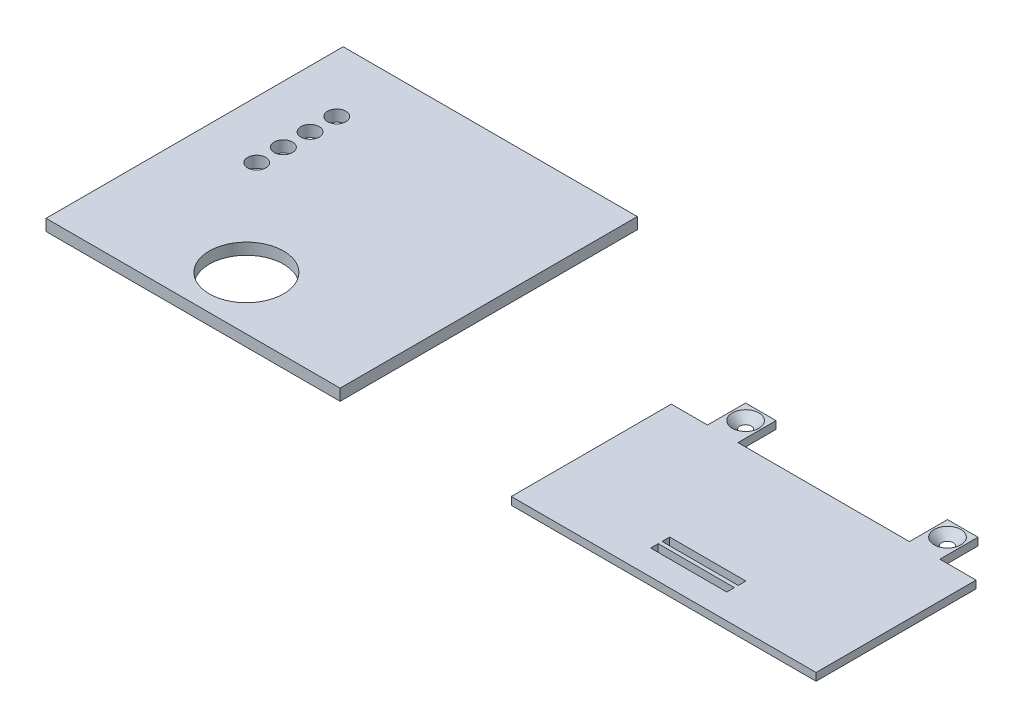
ISO-10303-21;
HEADER;
FILE_DESCRIPTION(('STEP AP214'),'2;1');
FILE_NAME('part.step','',(''),(''),'','','');
FILE_SCHEMA(('AUTOMOTIVE_DESIGN { 1 0 10303 214 1 1 1 1 }'));
ENDSEC;
DATA;
#1=APPLICATION_CONTEXT('core data for automotive mechanical design processes');
#2=APPLICATION_PROTOCOL_DEFINITION('international standard','automotive_design',2000,#1);
#3=PRODUCT_CONTEXT('',#1,'mechanical');
#4=PRODUCT('Part','Part','',(#3));
#5=PRODUCT_RELATED_PRODUCT_CATEGORY('part','',(#4));
#6=PRODUCT_DEFINITION_FORMATION('','',#4);
#7=PRODUCT_DEFINITION_CONTEXT('part definition',#1,'design');
#8=PRODUCT_DEFINITION('design','',#6,#7);
#9=PRODUCT_DEFINITION_SHAPE('','',#8);
#10=(LENGTH_UNIT() NAMED_UNIT(*) SI_UNIT(.MILLI.,.METRE.));
#11=(NAMED_UNIT(*) PLANE_ANGLE_UNIT() SI_UNIT($,.RADIAN.));
#12=(NAMED_UNIT(*) SI_UNIT($,.STERADIAN.) SOLID_ANGLE_UNIT());
#13=UNCERTAINTY_MEASURE_WITH_UNIT(LENGTH_MEASURE(1.E-05),#10,'distance_accuracy_value','');
#14=(GEOMETRIC_REPRESENTATION_CONTEXT(3) GLOBAL_UNCERTAINTY_ASSIGNED_CONTEXT((#13)) GLOBAL_UNIT_ASSIGNED_CONTEXT((#10,
#11,#12)) REPRESENTATION_CONTEXT('',''));
#15=CARTESIAN_POINT('',(0.,0.,0.));
#16=DIRECTION('',(0.,0.,1.));
#17=DIRECTION('',(1.,0.,0.));
#18=AXIS2_PLACEMENT_3D('',#15,#16,#17);
#19=CARTESIAN_POINT('',(-36.8821964652426,-2.,-61.3775431410421));
#20=DIRECTION('',(0.,0.,-1.));
#21=DIRECTION('',(-1.,0.,0.));
#22=AXIS2_PLACEMENT_3D('',#19,#20,#21);
#23=PLANE('',#22);
#24=DIRECTION('',(-1.,0.,0.));
#25=VECTOR('',#24,1.);
#26=CARTESIAN_POINT('',(-36.8821964652426,0.,-61.3775431410421));
#27=LINE('',#26,#25);
#28=CARTESIAN_POINT('',(33.6178035347574,0.,-61.3775431410421));
#29=VERTEX_POINT('',#28);
#30=CARTESIAN_POINT('',(25.6178035347574,0.,-61.3775431410421));
#31=VERTEX_POINT('',#30);
#32=EDGE_CURVE('E309',#29,#31,#27,.T.);
#33=ORIENTED_EDGE('',*,*,#32,.F.);
#34=DIRECTION('',(0.,-1.,0.));
#35=VECTOR('',#34,1.);
#36=CARTESIAN_POINT('',(33.6178035347574,64.,-61.3775431410421));
#37=LINE('',#36,#35);
#38=CARTESIAN_POINT('',(33.6178035347574,-2.,-61.3775431410421));
#39=VERTEX_POINT('',#38);
#40=EDGE_CURVE('E263',#29,#39,#37,.T.);
#41=ORIENTED_EDGE('',*,*,#40,.T.);
#42=DIRECTION('',(-1.,0.,0.));
#43=VECTOR('',#42,1.);
#44=CARTESIAN_POINT('',(-36.8821964652426,-2.,-61.3775431410421));
#45=LINE('',#44,#43);
#46=CARTESIAN_POINT('',(25.6178035347574,-2.,-61.3775431410421));
#47=VERTEX_POINT('',#46);
#48=EDGE_CURVE('E316',#39,#47,#45,.T.);
#49=ORIENTED_EDGE('',*,*,#48,.T.);
#50=DIRECTION('',(0.,-1.,0.));
#51=VECTOR('',#50,1.);
#52=CARTESIAN_POINT('',(25.6178035347574,54.,-61.3775431410421));
#53=LINE('',#52,#51);
#54=EDGE_CURVE('E276',#31,#47,#53,.T.);
#55=ORIENTED_EDGE('',*,*,#54,.F.);
#56=EDGE_LOOP('',(#33,#41,#49,#55));
#57=FACE_BOUND('',#56,.T.);
#58=ADVANCED_FACE('F46',(#57),#23,.T.);
#59=CARTESIAN_POINT('',(0.,-2.,0.));
#60=DIRECTION('',(0.,1.,0.));
#61=DIRECTION('',(0.,0.,1.));
#62=AXIS2_PLACEMENT_3D('',#59,#60,#61);
#63=PLANE('',#62);
#64=DIRECTION('',(-1.,0.,0.));
#65=VECTOR('',#64,1.);
#66=CARTESIAN_POINT('',(-6.88219646524261,-1.99999999999995,-17.9462363350968));
#67=LINE('',#66,#65);
#68=CARTESIAN_POINT('',(13.1178035347574,-1.99999999999995,-17.9462363350969));
#69=VERTEX_POINT('',#68);
#70=CARTESIAN_POINT('',(-6.88219646524261,-1.99999999999995,-17.9462363350968));
#71=VERTEX_POINT('',#70);
#72=EDGE_CURVE('E196',#69,#71,#67,.T.);
#73=ORIENTED_EDGE('',*,*,#72,.T.);
#74=DIRECTION('',(0.,0.,1.));
#75=VECTOR('',#74,1.);
#76=CARTESIAN_POINT('',(-6.88219646524261,-1.99999999999995,-17.9462363350968));
#77=LINE('',#76,#75);
#78=CARTESIAN_POINT('',(-6.88219646524261,-1.99999999999995,-15.9462363350968));
#79=VERTEX_POINT('',#78);
#80=EDGE_CURVE('E188',#71,#79,#77,.T.);
#81=ORIENTED_EDGE('',*,*,#80,.T.);
#82=DIRECTION('',(1.,0.,0.));
#83=VECTOR('',#82,1.);
#84=CARTESIAN_POINT('',(-6.88219646524261,-1.99999999999995,-15.9462363350968));
#85=LINE('',#84,#83);
#86=CARTESIAN_POINT('',(13.1178035347574,-2.,-15.9462363350968));
#87=VERTEX_POINT('',#86);
#88=EDGE_CURVE('E199',#79,#87,#85,.T.);
#89=ORIENTED_EDGE('',*,*,#88,.T.);
#90=DIRECTION('',(0.,0.,-1.));
#91=VECTOR('',#90,1.);
#92=CARTESIAN_POINT('',(13.1178035347574,-1.99999999999995,-17.9462363350969));
#93=LINE('',#92,#91);
#94=EDGE_CURVE('E62',#87,#69,#93,.T.);
#95=ORIENTED_EDGE('',*,*,#94,.T.);
#96=EDGE_LOOP('',(#73,#81,#89,#95));
#97=FACE_BOUND('',#96,.T.);
#98=DIRECTION('',(-1.,0.,0.));
#99=VECTOR('',#98,1.);
#100=CARTESIAN_POINT('',(-6.88219646524261,-1.99999999999995,-20.9462363350968));
#101=LINE('',#100,#99);
#102=CARTESIAN_POINT('',(13.1178035347574,-1.99999999999995,-20.9462363350968));
#103=VERTEX_POINT('',#102);
#104=CARTESIAN_POINT('',(-6.88219646524261,-1.99999999999995,-20.9462363350968));
#105=VERTEX_POINT('',#104);
#106=EDGE_CURVE('E234',#103,#105,#101,.T.);
#107=ORIENTED_EDGE('',*,*,#106,.T.);
#108=DIRECTION('',(0.,0.,1.));
#109=VECTOR('',#108,1.);
#110=CARTESIAN_POINT('',(-6.88219646524261,-1.99999999999995,-20.9462363350968));
#111=LINE('',#110,#109);
#112=CARTESIAN_POINT('',(-6.88219646524261,-1.99999999999995,-18.9462363350968));
#113=VERTEX_POINT('',#112);
#114=EDGE_CURVE('E226',#105,#113,#111,.T.);
#115=ORIENTED_EDGE('',*,*,#114,.T.);
#116=DIRECTION('',(1.,0.,0.));
#117=VECTOR('',#116,1.);
#118=CARTESIAN_POINT('',(-6.88219646524261,-1.99999999999995,-18.9462363350968));
#119=LINE('',#118,#117);
#120=CARTESIAN_POINT('',(13.1178035347574,-2.,-18.9462363350968));
#121=VERTEX_POINT('',#120);
#122=EDGE_CURVE('E229',#113,#121,#119,.T.);
#123=ORIENTED_EDGE('',*,*,#122,.T.);
#124=DIRECTION('',(0.,0.,-1.));
#125=VECTOR('',#124,1.);
#126=CARTESIAN_POINT('',(13.1178035347574,-1.99999999999995,-20.9462363350968));
#127=LINE('',#126,#125);
#128=EDGE_CURVE('E70',#121,#103,#127,.T.);
#129=ORIENTED_EDGE('',*,*,#128,.T.);
#130=EDGE_LOOP('',(#107,#115,#123,#129));
#131=FACE_BOUND('',#130,.T.);
#132=CARTESIAN_POINT('',(29.6178035347574,-2.,-57.3775431410421));
#133=DIRECTION('',(0.,1.,0.));
#134=DIRECTION('',(0.,0.,1.));
#135=AXIS2_PLACEMENT_3D('',#132,#133,#134);
#136=CIRCLE('',#135,1.5);
#137=CARTESIAN_POINT('',(29.6178035347574,-2.,-55.8775431410421));
#138=VERTEX_POINT('',#137);
#139=EDGE_CURVE('E222',#138,#138,#136,.F.);
#140=ORIENTED_EDGE('',*,*,#139,.F.);
#141=EDGE_LOOP('',(#140));
#142=FACE_BOUND('',#141,.T.);
#143=CARTESIAN_POINT('',(-23.3821964652426,-2.,-57.3775431410421));
#144=DIRECTION('',(0.,1.,0.));
#145=DIRECTION('',(0.,0.,1.));
#146=AXIS2_PLACEMENT_3D('',#143,#144,#145);
#147=CIRCLE('',#146,1.5);
#148=CARTESIAN_POINT('',(-23.3821964652426,-2.,-55.8775431410421));
#149=VERTEX_POINT('',#148);
#150=EDGE_CURVE('E257',#149,#149,#147,.F.);
#151=ORIENTED_EDGE('',*,*,#150,.F.);
#152=EDGE_LOOP('',(#151));
#153=FACE_BOUND('',#152,.T.);
#154=DIRECTION('',(0.,0.,-1.));
#155=VECTOR('',#154,1.);
#156=CARTESIAN_POINT('',(33.6178035347574,-2.,0.));
#157=LINE('',#156,#155);
#158=CARTESIAN_POINT('',(33.6178035347574,-2.,-51.3775431410421));
#159=VERTEX_POINT('',#158);
#160=EDGE_CURVE('E271',#159,#39,#157,.T.);
#161=ORIENTED_EDGE('',*,*,#160,.F.);
#162=DIRECTION('',(-1.,0.,0.));
#163=VECTOR('',#162,1.);
#164=CARTESIAN_POINT('',(0.,-2.,-51.3775431410421));
#165=LINE('',#164,#163);
#166=CARTESIAN_POINT('',(43.1178035347574,-2.,-51.3775431410421));
#167=VERTEX_POINT('',#166);
#168=EDGE_CURVE('E269',#167,#159,#165,.T.);
#169=ORIENTED_EDGE('',*,*,#168,.F.);
#170=DIRECTION('',(0.,0.,-1.));
#171=VECTOR('',#170,1.);
#172=CARTESIAN_POINT('',(43.1178035347574,-2.,-61.3775431410421));
#173=LINE('',#172,#171);
#174=CARTESIAN_POINT('',(43.1178035347574,-2.,-9.37754314104211));
#175=VERTEX_POINT('',#174);
#176=EDGE_CURVE('E312',#175,#167,#173,.T.);
#177=ORIENTED_EDGE('',*,*,#176,.F.);
#178=DIRECTION('',(1.,0.,0.));
#179=VECTOR('',#178,1.);
#180=CARTESIAN_POINT('',(-36.8821964652426,-2.,-9.37754314104211));
#181=LINE('',#180,#179);
#182=CARTESIAN_POINT('',(-36.8821964652426,-2.,-9.37754314104211));
#183=VERTEX_POINT('',#182);
#184=EDGE_CURVE('E308',#183,#175,#181,.T.);
#185=ORIENTED_EDGE('',*,*,#184,.F.);
#186=DIRECTION('',(0.,0.,1.));
#187=VECTOR('',#186,1.);
#188=CARTESIAN_POINT('',(-36.8821964652426,-2.,-61.3775431410421));
#189=LINE('',#188,#187);
#190=CARTESIAN_POINT('',(-36.8821964652426,-2.,-51.3775431410421));
#191=VERTEX_POINT('',#190);
#192=EDGE_CURVE('E306',#191,#183,#189,.T.);
#193=ORIENTED_EDGE('',*,*,#192,.F.);
#194=DIRECTION('',(1.,0.,0.));
#195=VECTOR('',#194,1.);
#196=CARTESIAN_POINT('',(0.,-2.,-51.3775431410421));
#197=LINE('',#196,#195);
#198=CARTESIAN_POINT('',(-27.3821964652426,-2.,-51.3775431410421));
#199=VERTEX_POINT('',#198);
#200=EDGE_CURVE('E295',#191,#199,#197,.T.);
#201=ORIENTED_EDGE('',*,*,#200,.T.);
#202=DIRECTION('',(0.,0.,-1.));
#203=VECTOR('',#202,1.);
#204=CARTESIAN_POINT('',(-27.3821964652426,-2.,0.));
#205=LINE('',#204,#203);
#206=CARTESIAN_POINT('',(-27.3821964652426,-2.,-61.3775431410421));
#207=VERTEX_POINT('',#206);
#208=EDGE_CURVE('E302',#199,#207,#205,.T.);
#209=ORIENTED_EDGE('',*,*,#208,.T.);
#210=CARTESIAN_POINT('',(-19.3821964652426,-2.,-61.3775431410421));
#211=VERTEX_POINT('',#210);
#212=EDGE_CURVE('E315',#211,#207,#45,.T.);
#213=ORIENTED_EDGE('',*,*,#212,.F.);
#214=DIRECTION('',(0.,0.,-1.));
#215=VECTOR('',#214,1.);
#216=CARTESIAN_POINT('',(-19.3821964652426,-2.,0.));
#217=LINE('',#216,#215);
#218=CARTESIAN_POINT('',(-19.3821964652426,-2.,-51.3775431410421));
#219=VERTEX_POINT('',#218);
#220=EDGE_CURVE('E289',#219,#211,#217,.T.);
#221=ORIENTED_EDGE('',*,*,#220,.F.);
#222=DIRECTION('',(-1.,0.,0.));
#223=VECTOR('',#222,1.);
#224=CARTESIAN_POINT('',(0.,-2.,-51.3775431410421));
#225=LINE('',#224,#223);
#226=CARTESIAN_POINT('',(25.6178035347574,-2.,-51.3775431410421));
#227=VERTEX_POINT('',#226);
#228=EDGE_CURVE('E287',#227,#219,#225,.T.);
#229=ORIENTED_EDGE('',*,*,#228,.F.);
#230=DIRECTION('',(0.,0.,1.));
#231=VECTOR('',#230,1.);
#232=CARTESIAN_POINT('',(25.6178035347574,-2.,0.));
#233=LINE('',#232,#231);
#234=EDGE_CURVE('E285',#47,#227,#233,.T.);
#235=ORIENTED_EDGE('',*,*,#234,.F.);
#236=ORIENTED_EDGE('',*,*,#48,.F.);
#237=EDGE_LOOP('',(#161,#169,#177,#185,#193,#201,#209,#213,#221,#229,#235,#236));
#238=FACE_BOUND('',#237,.T.);
#239=ADVANCED_FACE('F203',(#97,#131,#142,#153,#238),#63,.F.);
#240=CARTESIAN_POINT('',(0.,0.,0.));
#241=DIRECTION('',(0.,1.,0.));
#242=DIRECTION('',(0.,0.,1.));
#243=AXIS2_PLACEMENT_3D('',#240,#241,#242);
#244=PLANE('',#243);
#245=DIRECTION('',(0.,0.,1.));
#246=VECTOR('',#245,1.);
#247=CARTESIAN_POINT('',(-6.88219646524261,0.,-17.9462363350968));
#248=LINE('',#247,#246);
#249=CARTESIAN_POINT('',(-6.88219646524261,0.,-17.9462363350968));
#250=VERTEX_POINT('',#249);
#251=CARTESIAN_POINT('',(-6.88219646524261,0.,-15.9462363350968));
#252=VERTEX_POINT('',#251);
#253=EDGE_CURVE('E191',#250,#252,#248,.T.);
#254=ORIENTED_EDGE('',*,*,#253,.F.);
#255=DIRECTION('',(-1.,0.,0.));
#256=VECTOR('',#255,1.);
#257=CARTESIAN_POINT('',(-6.88219646524261,0.,-17.9462363350968));
#258=LINE('',#257,#256);
#259=CARTESIAN_POINT('',(13.1178035347574,0.,-17.9462363350969));
#260=VERTEX_POINT('',#259);
#261=EDGE_CURVE('E206',#260,#250,#258,.T.);
#262=ORIENTED_EDGE('',*,*,#261,.F.);
#263=DIRECTION('',(0.,0.,-1.));
#264=VECTOR('',#263,1.);
#265=CARTESIAN_POINT('',(13.1178035347574,0.,-17.9462363350969));
#266=LINE('',#265,#264);
#267=CARTESIAN_POINT('',(13.1178035347574,0.,-15.9462363350968));
#268=VERTEX_POINT('',#267);
#269=EDGE_CURVE('E209',#268,#260,#266,.T.);
#270=ORIENTED_EDGE('',*,*,#269,.F.);
#271=DIRECTION('',(1.,0.,0.));
#272=VECTOR('',#271,1.);
#273=CARTESIAN_POINT('',(-6.88219646524261,0.,-15.9462363350968));
#274=LINE('',#273,#272);
#275=EDGE_CURVE('E215',#252,#268,#274,.T.);
#276=ORIENTED_EDGE('',*,*,#275,.F.);
#277=EDGE_LOOP('',(#254,#262,#270,#276));
#278=FACE_BOUND('',#277,.T.);
#279=DIRECTION('',(0.,0.,1.));
#280=VECTOR('',#279,1.);
#281=CARTESIAN_POINT('',(-6.88219646524261,0.,-20.9462363350968));
#282=LINE('',#281,#280);
#283=CARTESIAN_POINT('',(-6.88219646524261,0.,-20.9462363350968));
#284=VERTEX_POINT('',#283);
#285=CARTESIAN_POINT('',(-6.88219646524261,0.,-18.9462363350968));
#286=VERTEX_POINT('',#285);
#287=EDGE_CURVE('E238',#284,#286,#282,.T.);
#288=ORIENTED_EDGE('',*,*,#287,.F.);
#289=DIRECTION('',(-1.,0.,0.));
#290=VECTOR('',#289,1.);
#291=CARTESIAN_POINT('',(-6.88219646524261,0.,-20.9462363350968));
#292=LINE('',#291,#290);
#293=CARTESIAN_POINT('',(13.1178035347574,0.,-20.9462363350968));
#294=VERTEX_POINT('',#293);
#295=EDGE_CURVE('E230',#294,#284,#292,.T.);
#296=ORIENTED_EDGE('',*,*,#295,.F.);
#297=DIRECTION('',(0.,0.,-1.));
#298=VECTOR('',#297,1.);
#299=CARTESIAN_POINT('',(13.1178035347574,0.,-20.9462363350968));
#300=LINE('',#299,#298);
#301=CARTESIAN_POINT('',(13.1178035347574,0.,-18.9462363350968));
#302=VERTEX_POINT('',#301);
#303=EDGE_CURVE('E243',#302,#294,#300,.T.);
#304=ORIENTED_EDGE('',*,*,#303,.F.);
#305=DIRECTION('',(1.,0.,0.));
#306=VECTOR('',#305,1.);
#307=CARTESIAN_POINT('',(-6.88219646524261,0.,-18.9462363350968));
#308=LINE('',#307,#306);
#309=EDGE_CURVE('E240',#286,#302,#308,.T.);
#310=ORIENTED_EDGE('',*,*,#309,.F.);
#311=EDGE_LOOP('',(#288,#296,#304,#310));
#312=FACE_BOUND('',#311,.T.);
#313=CARTESIAN_POINT('',(29.6178035347574,0.,-57.3775431410421));
#314=DIRECTION('',(0.,1.,0.));
#315=DIRECTION('',(0.,0.,1.));
#316=AXIS2_PLACEMENT_3D('',#313,#314,#315);
#317=CIRCLE('',#316,3.49999999999999);
#318=CARTESIAN_POINT('',(29.6178035347574,0.,-53.8775431410421));
#319=VERTEX_POINT('',#318);
#320=EDGE_CURVE('E12',#319,#319,#317,.F.);
#321=ORIENTED_EDGE('',*,*,#320,.T.);
#322=EDGE_LOOP('',(#321));
#323=FACE_BOUND('',#322,.T.);
#324=CARTESIAN_POINT('',(-23.3821964652426,0.,-57.3775431410421));
#325=DIRECTION('',(0.,1.,0.));
#326=DIRECTION('',(0.,0.,1.));
#327=AXIS2_PLACEMENT_3D('',#324,#325,#326);
#328=CIRCLE('',#327,3.49999999999999);
#329=CARTESIAN_POINT('',(-23.3821964652426,0.,-53.8775431410421));
#330=VERTEX_POINT('',#329);
#331=EDGE_CURVE('E55',#330,#330,#328,.F.);
#332=ORIENTED_EDGE('',*,*,#331,.T.);
#333=EDGE_LOOP('',(#332));
#334=FACE_BOUND('',#333,.T.);
#335=DIRECTION('',(-1.,0.,0.));
#336=VECTOR('',#335,1.);
#337=CARTESIAN_POINT('',(0.,0.,-51.3775431410421));
#338=LINE('',#337,#336);
#339=CARTESIAN_POINT('',(43.1178035347574,0.,-51.3775431410421));
#340=VERTEX_POINT('',#339);
#341=CARTESIAN_POINT('',(33.6178035347574,0.,-51.3775431410421));
#342=VERTEX_POINT('',#341);
#343=EDGE_CURVE('E266',#340,#342,#338,.T.);
#344=ORIENTED_EDGE('',*,*,#343,.T.);
#345=DIRECTION('',(0.,0.,-1.));
#346=VECTOR('',#345,1.);
#347=CARTESIAN_POINT('',(33.6178035347574,0.,0.));
#348=LINE('',#347,#346);
#349=EDGE_CURVE('E349',#342,#29,#348,.T.);
#350=ORIENTED_EDGE('',*,*,#349,.T.);
#351=ORIENTED_EDGE('',*,*,#32,.T.);
#352=DIRECTION('',(0.,0.,1.));
#353=VECTOR('',#352,1.);
#354=CARTESIAN_POINT('',(25.6178035347574,0.,0.));
#355=LINE('',#354,#353);
#356=CARTESIAN_POINT('',(25.6178035347574,0.,-51.3775431410421));
#357=VERTEX_POINT('',#356);
#358=EDGE_CURVE('E337',#31,#357,#355,.T.);
#359=ORIENTED_EDGE('',*,*,#358,.T.);
#360=DIRECTION('',(-1.,0.,0.));
#361=VECTOR('',#360,1.);
#362=CARTESIAN_POINT('',(0.,0.,-51.3775431410421));
#363=LINE('',#362,#361);
#364=CARTESIAN_POINT('',(-19.3821964652426,0.,-51.3775431410421));
#365=VERTEX_POINT('',#364);
#366=EDGE_CURVE('E340',#357,#365,#363,.T.);
#367=ORIENTED_EDGE('',*,*,#366,.T.);
#368=DIRECTION('',(0.,0.,-1.));
#369=VECTOR('',#368,1.);
#370=CARTESIAN_POINT('',(-19.3821964652426,0.,0.));
#371=LINE('',#370,#369);
#372=CARTESIAN_POINT('',(-19.3821964652426,0.,-61.3775431410421));
#373=VERTEX_POINT('',#372);
#374=EDGE_CURVE('E343',#365,#373,#371,.T.);
#375=ORIENTED_EDGE('',*,*,#374,.T.);
#376=CARTESIAN_POINT('',(-27.3821964652426,0.,-61.3775431410421));
#377=VERTEX_POINT('',#376);
#378=EDGE_CURVE('E326',#373,#377,#27,.T.);
#379=ORIENTED_EDGE('',*,*,#378,.T.);
#380=DIRECTION('',(0.,0.,-1.));
#381=VECTOR('',#380,1.);
#382=CARTESIAN_POINT('',(-27.3821964652426,0.,0.));
#383=LINE('',#382,#381);
#384=CARTESIAN_POINT('',(-27.3821964652426,0.,-51.3775431410421));
#385=VERTEX_POINT('',#384);
#386=EDGE_CURVE('E334',#385,#377,#383,.T.);
#387=ORIENTED_EDGE('',*,*,#386,.F.);
#388=DIRECTION('',(1.,0.,0.));
#389=VECTOR('',#388,1.);
#390=CARTESIAN_POINT('',(0.,0.,-51.3775431410421));
#391=LINE('',#390,#389);
#392=CARTESIAN_POINT('',(-36.8821964652426,0.,-51.3775431410421));
#393=VERTEX_POINT('',#392);
#394=EDGE_CURVE('E330',#393,#385,#391,.T.);
#395=ORIENTED_EDGE('',*,*,#394,.F.);
#396=DIRECTION('',(0.,0.,1.));
#397=VECTOR('',#396,1.);
#398=CARTESIAN_POINT('',(-36.8821964652426,0.,-61.3775431410421));
#399=LINE('',#398,#397);
#400=CARTESIAN_POINT('',(-36.8821964652426,0.,-9.37754314104211));
#401=VERTEX_POINT('',#400);
#402=EDGE_CURVE('E305',#393,#401,#399,.T.);
#403=ORIENTED_EDGE('',*,*,#402,.T.);
#404=DIRECTION('',(1.,0.,0.));
#405=VECTOR('',#404,1.);
#406=CARTESIAN_POINT('',(-36.8821964652426,0.,-9.37754314104211));
#407=LINE('',#406,#405);
#408=CARTESIAN_POINT('',(43.1178035347574,0.,-9.37754314104211));
#409=VERTEX_POINT('',#408);
#410=EDGE_CURVE('E320',#401,#409,#407,.T.);
#411=ORIENTED_EDGE('',*,*,#410,.T.);
#412=DIRECTION('',(0.,0.,-1.));
#413=VECTOR('',#412,1.);
#414=CARTESIAN_POINT('',(43.1178035347574,0.,-61.3775431410421));
#415=LINE('',#414,#413);
#416=EDGE_CURVE('E323',#409,#340,#415,.T.);
#417=ORIENTED_EDGE('',*,*,#416,.T.);
#418=EDGE_LOOP('',(#344,#350,#351,#359,#367,#375,#379,#387,#395,#403,#411,#417));
#419=FACE_BOUND('',#418,.T.);
#420=ADVANCED_FACE('F354',(#278,#312,#323,#334,#419),#244,.T.);
#421=CARTESIAN_POINT('',(43.1178035347574,-2.,-61.3775431410421));
#422=DIRECTION('',(1.,0.,0.));
#423=DIRECTION('',(0.,0.,-1.));
#424=AXIS2_PLACEMENT_3D('',#421,#422,#423);
#425=PLANE('',#424);
#426=ORIENTED_EDGE('',*,*,#176,.T.);
#427=DIRECTION('',(0.,1.,0.));
#428=VECTOR('',#427,1.);
#429=CARTESIAN_POINT('',(43.1178035347574,-2.,-51.3775431410421));
#430=LINE('',#429,#428);
#431=EDGE_CURVE('E346',#167,#340,#430,.T.);
#432=ORIENTED_EDGE('',*,*,#431,.T.);
#433=ORIENTED_EDGE('',*,*,#416,.F.);
#434=DIRECTION('',(0.,1.,0.));
#435=VECTOR('',#434,1.);
#436=CARTESIAN_POINT('',(43.1178035347574,-2.,-9.37754314104211));
#437=LINE('',#436,#435);
#438=EDGE_CURVE('E328',#175,#409,#437,.T.);
#439=ORIENTED_EDGE('',*,*,#438,.F.);
#440=EDGE_LOOP('',(#426,#432,#433,#439));
#441=FACE_BOUND('',#440,.T.);
#442=ADVANCED_FACE('F385',(#441),#425,.T.);
#443=ORIENTED_EDGE('',*,*,#378,.F.);
#444=DIRECTION('',(0.,-1.,0.));
#445=VECTOR('',#444,1.);
#446=CARTESIAN_POINT('',(-19.3821964652426,54.,-61.3775431410421));
#447=LINE('',#446,#445);
#448=EDGE_CURVE('E273',#373,#211,#447,.T.);
#449=ORIENTED_EDGE('',*,*,#448,.T.);
#450=ORIENTED_EDGE('',*,*,#212,.T.);
#451=DIRECTION('',(0.,1.,0.));
#452=VECTOR('',#451,1.);
#453=CARTESIAN_POINT('',(-27.3821964652426,-32.,-61.3775431410421));
#454=LINE('',#453,#452);
#455=EDGE_CURVE('E292',#207,#377,#454,.T.);
#456=ORIENTED_EDGE('',*,*,#455,.T.);
#457=EDGE_LOOP('',(#443,#449,#450,#456));
#458=FACE_BOUND('',#457,.T.);
#459=ADVANCED_FACE('F375',(#458),#23,.T.);
#460=CARTESIAN_POINT('',(-36.8821964652426,-2.,-61.3775431410421));
#461=DIRECTION('',(-1.,0.,0.));
#462=DIRECTION('',(0.,0.,1.));
#463=AXIS2_PLACEMENT_3D('',#460,#461,#462);
#464=PLANE('',#463);
#465=DIRECTION('',(0.,1.,0.));
#466=VECTOR('',#465,1.);
#467=CARTESIAN_POINT('',(-36.8821964652426,-32.,-51.3775431410421));
#468=LINE('',#467,#466);
#469=EDGE_CURVE('E291',#191,#393,#468,.T.);
#470=ORIENTED_EDGE('',*,*,#469,.F.);
#471=ORIENTED_EDGE('',*,*,#192,.T.);
#472=DIRECTION('',(0.,1.,0.));
#473=VECTOR('',#472,1.);
#474=CARTESIAN_POINT('',(-36.8821964652426,-2.,-9.37754314104211));
#475=LINE('',#474,#473);
#476=EDGE_CURVE('E318',#183,#401,#475,.T.);
#477=ORIENTED_EDGE('',*,*,#476,.T.);
#478=ORIENTED_EDGE('',*,*,#402,.F.);
#479=EDGE_LOOP('',(#470,#471,#477,#478));
#480=FACE_BOUND('',#479,.T.);
#481=ADVANCED_FACE('F384',(#480),#464,.T.);
#482=CARTESIAN_POINT('',(-36.8821964652426,-2.,-9.37754314104211));
#483=DIRECTION('',(0.,0.,1.));
#484=DIRECTION('',(1.,0.,0.));
#485=AXIS2_PLACEMENT_3D('',#482,#483,#484);
#486=PLANE('',#485);
#487=ORIENTED_EDGE('',*,*,#410,.F.);
#488=ORIENTED_EDGE('',*,*,#476,.F.);
#489=ORIENTED_EDGE('',*,*,#184,.T.);
#490=ORIENTED_EDGE('',*,*,#438,.T.);
#491=EDGE_LOOP('',(#487,#488,#489,#490));
#492=FACE_BOUND('',#491,.T.);
#493=ADVANCED_FACE('F391',(#492),#486,.T.);
#494=CARTESIAN_POINT('',(-27.3821964652426,-32.,-61.3775431410421));
#495=DIRECTION('',(1.,0.,0.));
#496=DIRECTION('',(0.,0.,-1.));
#497=AXIS2_PLACEMENT_3D('',#494,#495,#496);
#498=PLANE('',#497);
#499=DIRECTION('',(0.,1.,0.));
#500=VECTOR('',#499,1.);
#501=CARTESIAN_POINT('',(-27.3821964652426,-32.,-51.3775431410421));
#502=LINE('',#501,#500);
#503=EDGE_CURVE('E296',#199,#385,#502,.T.);
#504=ORIENTED_EDGE('',*,*,#503,.T.);
#505=ORIENTED_EDGE('',*,*,#386,.T.);
#506=ORIENTED_EDGE('',*,*,#455,.F.);
#507=ORIENTED_EDGE('',*,*,#208,.F.);
#508=EDGE_LOOP('',(#504,#505,#506,#507));
#509=FACE_BOUND('',#508,.T.);
#510=ADVANCED_FACE('F400',(#509),#498,.F.);
#511=CARTESIAN_POINT('',(-36.8821964652426,-32.,-51.3775431410421));
#512=DIRECTION('',(0.,0.,1.));
#513=DIRECTION('',(1.,0.,0.));
#514=AXIS2_PLACEMENT_3D('',#511,#512,#513);
#515=PLANE('',#514);
#516=ORIENTED_EDGE('',*,*,#469,.T.);
#517=ORIENTED_EDGE('',*,*,#394,.T.);
#518=ORIENTED_EDGE('',*,*,#503,.F.);
#519=ORIENTED_EDGE('',*,*,#200,.F.);
#520=EDGE_LOOP('',(#516,#517,#518,#519));
#521=FACE_BOUND('',#520,.T.);
#522=ADVANCED_FACE('F403',(#521),#515,.F.);
#523=CARTESIAN_POINT('',(-19.3821964652426,54.,-61.3775431410421));
#524=DIRECTION('',(1.,0.,0.));
#525=DIRECTION('',(0.,0.,-1.));
#526=AXIS2_PLACEMENT_3D('',#523,#524,#525);
#527=PLANE('',#526);
#528=ORIENTED_EDGE('',*,*,#220,.T.);
#529=ORIENTED_EDGE('',*,*,#448,.F.);
#530=ORIENTED_EDGE('',*,*,#374,.F.);
#531=DIRECTION('',(0.,-1.,0.));
#532=VECTOR('',#531,1.);
#533=CARTESIAN_POINT('',(-19.3821964652426,54.,-51.3775431410421));
#534=LINE('',#533,#532);
#535=EDGE_CURVE('E282',#365,#219,#534,.T.);
#536=ORIENTED_EDGE('',*,*,#535,.T.);
#537=EDGE_LOOP('',(#528,#529,#530,#536));
#538=FACE_BOUND('',#537,.T.);
#539=ADVANCED_FACE('F431',(#538),#527,.T.);
#540=CARTESIAN_POINT('',(-19.3821964652426,54.,-51.3775431410421));
#541=DIRECTION('',(0.,0.,-1.));
#542=DIRECTION('',(-1.,0.,0.));
#543=AXIS2_PLACEMENT_3D('',#540,#541,#542);
#544=PLANE('',#543);
#545=ORIENTED_EDGE('',*,*,#228,.T.);
#546=ORIENTED_EDGE('',*,*,#535,.F.);
#547=ORIENTED_EDGE('',*,*,#366,.F.);
#548=DIRECTION('',(0.,-1.,0.));
#549=VECTOR('',#548,1.);
#550=CARTESIAN_POINT('',(25.6178035347574,54.,-51.3775431410421));
#551=LINE('',#550,#549);
#552=EDGE_CURVE('E279',#357,#227,#551,.T.);
#553=ORIENTED_EDGE('',*,*,#552,.T.);
#554=EDGE_LOOP('',(#545,#546,#547,#553));
#555=FACE_BOUND('',#554,.T.);
#556=ADVANCED_FACE('F428',(#555),#544,.T.);
#557=CARTESIAN_POINT('',(25.6178035347574,54.,-61.3775431410421));
#558=DIRECTION('',(-1.,0.,0.));
#559=DIRECTION('',(0.,0.,1.));
#560=AXIS2_PLACEMENT_3D('',#557,#558,#559);
#561=PLANE('',#560);
#562=ORIENTED_EDGE('',*,*,#234,.T.);
#563=ORIENTED_EDGE('',*,*,#552,.F.);
#564=ORIENTED_EDGE('',*,*,#358,.F.);
#565=ORIENTED_EDGE('',*,*,#54,.T.);
#566=EDGE_LOOP('',(#562,#563,#564,#565));
#567=FACE_BOUND('',#566,.T.);
#568=ADVANCED_FACE('F423',(#567),#561,.T.);
#569=CARTESIAN_POINT('',(33.6178035347574,64.,-61.3775431410421));
#570=DIRECTION('',(1.,0.,0.));
#571=DIRECTION('',(0.,0.,-1.));
#572=AXIS2_PLACEMENT_3D('',#569,#570,#571);
#573=PLANE('',#572);
#574=ORIENTED_EDGE('',*,*,#160,.T.);
#575=ORIENTED_EDGE('',*,*,#40,.F.);
#576=ORIENTED_EDGE('',*,*,#349,.F.);
#577=DIRECTION('',(0.,-1.,0.));
#578=VECTOR('',#577,1.);
#579=CARTESIAN_POINT('',(33.6178035347574,64.,-51.3775431410421));
#580=LINE('',#579,#578);
#581=EDGE_CURVE('E260',#342,#159,#580,.T.);
#582=ORIENTED_EDGE('',*,*,#581,.T.);
#583=EDGE_LOOP('',(#574,#575,#576,#582));
#584=FACE_BOUND('',#583,.T.);
#585=ADVANCED_FACE('F367',(#584),#573,.T.);
#586=CARTESIAN_POINT('',(43.1178035347574,64.,-51.3775431410421));
#587=DIRECTION('',(0.,0.,-1.));
#588=DIRECTION('',(-1.,0.,0.));
#589=AXIS2_PLACEMENT_3D('',#586,#587,#588);
#590=PLANE('',#589);
#591=ORIENTED_EDGE('',*,*,#168,.T.);
#592=ORIENTED_EDGE('',*,*,#581,.F.);
#593=ORIENTED_EDGE('',*,*,#343,.F.);
#594=ORIENTED_EDGE('',*,*,#431,.F.);
#595=EDGE_LOOP('',(#591,#592,#593,#594));
#596=FACE_BOUND('',#595,.T.);
#597=ADVANCED_FACE('F359',(#596),#590,.T.);
#598=CARTESIAN_POINT('',(-23.3821964652426,0.,-57.3775431410421));
#599=DIRECTION('',(0.,1.,0.));
#600=DIRECTION('',(0.,0.,1.));
#601=AXIS2_PLACEMENT_3D('',#598,#599,#600);
#602=CONICAL_SURFACE('',#601,3.49999999999999,0.785398163397447);
#603=ORIENTED_EDGE('',*,*,#150,.T.);
#604=EDGE_LOOP('',(#603));
#605=FACE_BOUND('',#604,.T.);
#606=ORIENTED_EDGE('',*,*,#331,.F.);
#607=EDGE_LOOP('',(#606));
#608=FACE_BOUND('',#607,.T.);
#609=ADVANCED_FACE('F357',(#605,#608),#602,.F.);
#610=CARTESIAN_POINT('',(29.6178035347574,0.,-57.3775431410421));
#611=DIRECTION('',(0.,1.,0.));
#612=DIRECTION('',(0.,0.,1.));
#613=AXIS2_PLACEMENT_3D('',#610,#611,#612);
#614=CONICAL_SURFACE('',#613,3.49999999999999,0.785398163397446);
#615=ORIENTED_EDGE('',*,*,#139,.T.);
#616=EDGE_LOOP('',(#615));
#617=FACE_BOUND('',#616,.T.);
#618=ORIENTED_EDGE('',*,*,#320,.F.);
#619=EDGE_LOOP('',(#618));
#620=FACE_BOUND('',#619,.T.);
#621=ADVANCED_FACE('F49',(#617,#620),#614,.F.);
#622=CARTESIAN_POINT('',(-6.88219646524261,-1.99999999999995,-20.9462363350968));
#623=DIRECTION('',(-1.,0.,0.));
#624=DIRECTION('',(0.,0.,1.));
#625=AXIS2_PLACEMENT_3D('',#622,#623,#624);
#626=PLANE('',#625);
#627=ORIENTED_EDGE('',*,*,#287,.T.);
#628=DIRECTION('',(0.,1.,0.));
#629=VECTOR('',#628,1.);
#630=CARTESIAN_POINT('',(-6.88219646524261,-1.99999999999995,-18.9462363350968));
#631=LINE('',#630,#629);
#632=EDGE_CURVE('E237',#113,#286,#631,.T.);
#633=ORIENTED_EDGE('',*,*,#632,.F.);
#634=ORIENTED_EDGE('',*,*,#114,.F.);
#635=DIRECTION('',(0.,1.,0.));
#636=VECTOR('',#635,1.);
#637=CARTESIAN_POINT('',(-6.88219646524261,-1.99999999999995,-20.9462363350968));
#638=LINE('',#637,#636);
#639=EDGE_CURVE('E216',#105,#284,#638,.T.);
#640=ORIENTED_EDGE('',*,*,#639,.T.);
#641=EDGE_LOOP('',(#627,#633,#634,#640));
#642=FACE_BOUND('',#641,.T.);
#643=ADVANCED_FACE('F365',(#642),#626,.F.);
#644=CARTESIAN_POINT('',(-6.88219646524261,-1.99999999999995,-20.9462363350968));
#645=DIRECTION('',(0.,0.,-1.));
#646=DIRECTION('',(-1.,0.,0.));
#647=AXIS2_PLACEMENT_3D('',#644,#645,#646);
#648=PLANE('',#647);
#649=ORIENTED_EDGE('',*,*,#295,.T.);
#650=ORIENTED_EDGE('',*,*,#639,.F.);
#651=ORIENTED_EDGE('',*,*,#106,.F.);
#652=DIRECTION('',(0.,1.,0.));
#653=VECTOR('',#652,1.);
#654=CARTESIAN_POINT('',(13.1178035347574,-1.99999999999995,-20.9462363350968));
#655=LINE('',#654,#653);
#656=EDGE_CURVE('E249',#103,#294,#655,.T.);
#657=ORIENTED_EDGE('',*,*,#656,.T.);
#658=EDGE_LOOP('',(#649,#650,#651,#657));
#659=FACE_BOUND('',#658,.T.);
#660=ADVANCED_FACE('F464',(#659),#648,.F.);
#661=CARTESIAN_POINT('',(13.1178035347574,-1.99999999999995,-20.9462363350968));
#662=DIRECTION('',(1.,0.,0.));
#663=DIRECTION('',(0.,0.,-1.));
#664=AXIS2_PLACEMENT_3D('',#661,#662,#663);
#665=PLANE('',#664);
#666=ORIENTED_EDGE('',*,*,#303,.T.);
#667=ORIENTED_EDGE('',*,*,#656,.F.);
#668=ORIENTED_EDGE('',*,*,#128,.F.);
#669=DIRECTION('',(0.,1.,0.));
#670=VECTOR('',#669,1.);
#671=CARTESIAN_POINT('',(13.1178035347574,-1.99999999999995,-18.9462363350968));
#672=LINE('',#671,#670);
#673=EDGE_CURVE('E251',#121,#302,#672,.T.);
#674=ORIENTED_EDGE('',*,*,#673,.T.);
#675=EDGE_LOOP('',(#666,#667,#668,#674));
#676=FACE_BOUND('',#675,.T.);
#677=ADVANCED_FACE('F465',(#676),#665,.F.);
#678=CARTESIAN_POINT('',(-6.88219646524261,-1.99999999999995,-18.9462363350968));
#679=DIRECTION('',(0.,0.,1.));
#680=DIRECTION('',(1.,0.,0.));
#681=AXIS2_PLACEMENT_3D('',#678,#679,#680);
#682=PLANE('',#681);
#683=ORIENTED_EDGE('',*,*,#309,.T.);
#684=ORIENTED_EDGE('',*,*,#673,.F.);
#685=ORIENTED_EDGE('',*,*,#122,.F.);
#686=ORIENTED_EDGE('',*,*,#632,.T.);
#687=EDGE_LOOP('',(#683,#684,#685,#686));
#688=FACE_BOUND('',#687,.T.);
#689=ADVANCED_FACE('F460',(#688),#682,.F.);
#690=CARTESIAN_POINT('',(-6.88219646524261,-1.99999999999995,-17.9462363350968));
#691=DIRECTION('',(-1.,0.,0.));
#692=DIRECTION('',(0.,0.,1.));
#693=AXIS2_PLACEMENT_3D('',#690,#691,#692);
#694=PLANE('',#693);
#695=ORIENTED_EDGE('',*,*,#253,.T.);
#696=DIRECTION('',(0.,1.,0.));
#697=VECTOR('',#696,1.);
#698=CARTESIAN_POINT('',(-6.88219646524261,-1.99999999999995,-15.9462363350968));
#699=LINE('',#698,#697);
#700=EDGE_CURVE('E184',#79,#252,#699,.T.);
#701=ORIENTED_EDGE('',*,*,#700,.F.);
#702=ORIENTED_EDGE('',*,*,#80,.F.);
#703=DIRECTION('',(0.,1.,0.));
#704=VECTOR('',#703,1.);
#705=CARTESIAN_POINT('',(-6.88219646524261,-1.99999999999995,-17.9462363350968));
#706=LINE('',#705,#704);
#707=EDGE_CURVE('E220',#71,#250,#706,.T.);
#708=ORIENTED_EDGE('',*,*,#707,.T.);
#709=EDGE_LOOP('',(#695,#701,#702,#708));
#710=FACE_BOUND('',#709,.T.);
#711=ADVANCED_FACE('F186',(#710),#694,.F.);
#712=CARTESIAN_POINT('',(-6.88219646524261,-1.99999999999995,-17.9462363350968));
#713=DIRECTION('',(0.,0.,-1.));
#714=DIRECTION('',(-1.,0.,0.));
#715=AXIS2_PLACEMENT_3D('',#712,#713,#714);
#716=PLANE('',#715);
#717=ORIENTED_EDGE('',*,*,#261,.T.);
#718=ORIENTED_EDGE('',*,*,#707,.F.);
#719=ORIENTED_EDGE('',*,*,#72,.F.);
#720=DIRECTION('',(0.,1.,0.));
#721=VECTOR('',#720,1.);
#722=CARTESIAN_POINT('',(13.1178035347574,-1.99999999999995,-17.9462363350969));
#723=LINE('',#722,#721);
#724=EDGE_CURVE('E223',#69,#260,#723,.T.);
#725=ORIENTED_EDGE('',*,*,#724,.T.);
#726=EDGE_LOOP('',(#717,#718,#719,#725));
#727=FACE_BOUND('',#726,.T.);
#728=ADVANCED_FACE('F546',(#727),#716,.F.);
#729=CARTESIAN_POINT('',(13.1178035347574,-1.99999999999995,-17.9462363350969));
#730=DIRECTION('',(1.,0.,0.));
#731=DIRECTION('',(0.,0.,-1.));
#732=AXIS2_PLACEMENT_3D('',#729,#730,#731);
#733=PLANE('',#732);
#734=ORIENTED_EDGE('',*,*,#269,.T.);
#735=ORIENTED_EDGE('',*,*,#724,.F.);
#736=ORIENTED_EDGE('',*,*,#94,.F.);
#737=DIRECTION('',(0.,1.,0.));
#738=VECTOR('',#737,1.);
#739=CARTESIAN_POINT('',(13.1178035347574,-1.99999999999995,-15.9462363350968));
#740=LINE('',#739,#738);
#741=EDGE_CURVE('E195',#87,#268,#740,.T.);
#742=ORIENTED_EDGE('',*,*,#741,.T.);
#743=EDGE_LOOP('',(#734,#735,#736,#742));
#744=FACE_BOUND('',#743,.T.);
#745=ADVANCED_FACE('F554',(#744),#733,.F.);
#746=CARTESIAN_POINT('',(-6.88219646524261,-1.99999999999995,-15.9462363350968));
#747=DIRECTION('',(0.,0.,1.));
#748=DIRECTION('',(1.,0.,0.));
#749=AXIS2_PLACEMENT_3D('',#746,#747,#748);
#750=PLANE('',#749);
#751=ORIENTED_EDGE('',*,*,#275,.T.);
#752=ORIENTED_EDGE('',*,*,#741,.F.);
#753=ORIENTED_EDGE('',*,*,#88,.F.);
#754=ORIENTED_EDGE('',*,*,#700,.T.);
#755=EDGE_LOOP('',(#751,#752,#753,#754));
#756=FACE_BOUND('',#755,.T.);
#757=ADVANCED_FACE('F200',(#756),#750,.F.);
#758=CLOSED_SHELL('',(#58,#239,#420,#442,#459,#481,#493,#510,#522,#539,#556,#568,#585,#597,#609,
#621,#643,#660,#677,#689,#711,#728,#745,#757));
#759=MANIFOLD_SOLID_BREP('B2',#758);
#760=CARTESIAN_POINT('',(-158.176362237991,3.,-86.5492108688671));
#761=DIRECTION('',(1.,0.,0.));
#762=DIRECTION('',(0.,0.,-1.));
#763=AXIS2_PLACEMENT_3D('',#760,#761,#762);
#764=PLANE('',#763);
#765=DIRECTION('',(0.,0.,1.));
#766=VECTOR('',#765,1.);
#767=CARTESIAN_POINT('',(-158.176362237991,0.,-86.5492108688671));
#768=LINE('',#767,#766);
#769=CARTESIAN_POINT('',(-158.176362237991,0.,-86.5492108688671));
#770=VERTEX_POINT('',#769);
#771=CARTESIAN_POINT('',(-158.176362237991,0.,-8.54921086886712));
#772=VERTEX_POINT('',#771);
#773=EDGE_CURVE('E700',#770,#772,#768,.T.);
#774=ORIENTED_EDGE('',*,*,#773,.T.);
#775=DIRECTION('',(0.,-1.,0.));
#776=VECTOR('',#775,1.);
#777=CARTESIAN_POINT('',(-158.176362237991,3.,-8.54921086886712));
#778=LINE('',#777,#776);
#779=CARTESIAN_POINT('',(-158.176362237991,3.,-8.54921086886712));
#780=VERTEX_POINT('',#779);
#781=EDGE_CURVE('E44',#780,#772,#778,.T.);
#782=ORIENTED_EDGE('',*,*,#781,.F.);
#783=DIRECTION('',(0.,0.,1.));
#784=VECTOR('',#783,1.);
#785=CARTESIAN_POINT('',(-158.176362237991,3.,-86.5492108688671));
#786=LINE('',#785,#784);
#787=CARTESIAN_POINT('',(-158.176362237991,3.,-86.5492108688671));
#788=VERTEX_POINT('',#787);
#789=EDGE_CURVE('E687',#788,#780,#786,.T.);
#790=ORIENTED_EDGE('',*,*,#789,.F.);
#791=DIRECTION('',(0.,-1.,0.));
#792=VECTOR('',#791,1.);
#793=CARTESIAN_POINT('',(-158.176362237991,3.,-86.5492108688671));
#794=LINE('',#793,#792);
#795=EDGE_CURVE('E696',#788,#770,#794,.T.);
#796=ORIENTED_EDGE('',*,*,#795,.T.);
#797=EDGE_LOOP('',(#774,#782,#790,#796));
#798=FACE_BOUND('',#797,.T.);
#799=ADVANCED_FACE('F634',(#798),#764,.F.);
#800=CARTESIAN_POINT('',(-158.176362237991,3.,-8.54921086886712));
#801=DIRECTION('',(0.,0.,-1.));
#802=DIRECTION('',(-1.,0.,0.));
#803=AXIS2_PLACEMENT_3D('',#800,#801,#802);
#804=PLANE('',#803);
#805=DIRECTION('',(1.,0.,0.));
#806=VECTOR('',#805,1.);
#807=CARTESIAN_POINT('',(-158.176362237991,0.,-8.54921086886712));
#808=LINE('',#807,#806);
#809=CARTESIAN_POINT('',(-80.9763622379913,0.,-8.54921086886712));
#810=VERTEX_POINT('',#809);
#811=EDGE_CURVE('E691',#772,#810,#808,.T.);
#812=ORIENTED_EDGE('',*,*,#811,.T.);
#813=DIRECTION('',(0.,-1.,0.));
#814=VECTOR('',#813,1.);
#815=CARTESIAN_POINT('',(-80.9763622379913,3.,-8.54921086886712));
#816=LINE('',#815,#814);
#817=CARTESIAN_POINT('',(-80.9763622379913,3.,-8.54921086886712));
#818=VERTEX_POINT('',#817);
#819=EDGE_CURVE('E643',#818,#810,#816,.T.);
#820=ORIENTED_EDGE('',*,*,#819,.F.);
#821=DIRECTION('',(1.,0.,0.));
#822=VECTOR('',#821,1.);
#823=CARTESIAN_POINT('',(-158.176362237991,3.,-8.54921086886712));
#824=LINE('',#823,#822);
#825=EDGE_CURVE('E682',#780,#818,#824,.T.);
#826=ORIENTED_EDGE('',*,*,#825,.F.);
#827=ORIENTED_EDGE('',*,*,#781,.T.);
#828=EDGE_LOOP('',(#812,#820,#826,#827));
#829=FACE_BOUND('',#828,.T.);
#830=ADVANCED_FACE('F690',(#829),#804,.F.);
#831=CARTESIAN_POINT('',(-80.9763622379913,3.,-86.5492108688671));
#832=DIRECTION('',(-1.,0.,0.));
#833=DIRECTION('',(0.,0.,1.));
#834=AXIS2_PLACEMENT_3D('',#831,#832,#833);
#835=PLANE('',#834);
#836=DIRECTION('',(0.,0.,-1.));
#837=VECTOR('',#836,1.);
#838=CARTESIAN_POINT('',(-80.9763622379913,0.,-86.5492108688671));
#839=LINE('',#838,#837);
#840=CARTESIAN_POINT('',(-80.9763622379913,0.,-86.5492108688671));
#841=VERTEX_POINT('',#840);
#842=EDGE_CURVE('E669',#810,#841,#839,.T.);
#843=ORIENTED_EDGE('',*,*,#842,.T.);
#844=DIRECTION('',(0.,-1.,0.));
#845=VECTOR('',#844,1.);
#846=CARTESIAN_POINT('',(-80.9763622379913,3.,-86.5492108688671));
#847=LINE('',#846,#845);
#848=CARTESIAN_POINT('',(-80.9763622379913,3.,-86.5492108688671));
#849=VERTEX_POINT('',#848);
#850=EDGE_CURVE('E692',#849,#841,#847,.T.);
#851=ORIENTED_EDGE('',*,*,#850,.F.);
#852=DIRECTION('',(0.,0.,-1.));
#853=VECTOR('',#852,1.);
#854=CARTESIAN_POINT('',(-80.9763622379913,3.,-86.5492108688671));
#855=LINE('',#854,#853);
#856=EDGE_CURVE('E685',#818,#849,#855,.T.);
#857=ORIENTED_EDGE('',*,*,#856,.F.);
#858=ORIENTED_EDGE('',*,*,#819,.T.);
#859=EDGE_LOOP('',(#843,#851,#857,#858));
#860=FACE_BOUND('',#859,.T.);
#861=ADVANCED_FACE('F694',(#860),#835,.F.);
#862=CARTESIAN_POINT('',(-158.176362237991,3.,-86.5492108688671));
#863=DIRECTION('',(0.,0.,1.));
#864=DIRECTION('',(1.,0.,0.));
#865=AXIS2_PLACEMENT_3D('',#862,#863,#864);
#866=PLANE('',#865);
#867=DIRECTION('',(-1.,0.,0.));
#868=VECTOR('',#867,1.);
#869=CARTESIAN_POINT('',(-158.176362237991,0.,-86.5492108688671));
#870=LINE('',#869,#868);
#871=EDGE_CURVE('E675',#841,#770,#870,.T.);
#872=ORIENTED_EDGE('',*,*,#871,.T.);
#873=ORIENTED_EDGE('',*,*,#795,.F.);
#874=DIRECTION('',(-1.,0.,0.));
#875=VECTOR('',#874,1.);
#876=CARTESIAN_POINT('',(-158.176362237991,3.,-86.5492108688671));
#877=LINE('',#876,#875);
#878=EDGE_CURVE('E652',#849,#788,#877,.T.);
#879=ORIENTED_EDGE('',*,*,#878,.F.);
#880=ORIENTED_EDGE('',*,*,#850,.T.);
#881=EDGE_LOOP('',(#872,#873,#879,#880));
#882=FACE_BOUND('',#881,.T.);
#883=ADVANCED_FACE('F743',(#882),#866,.F.);
#884=CARTESIAN_POINT('',(0.,3.,0.));
#885=DIRECTION('',(0.,1.,0.));
#886=DIRECTION('',(0.,0.,1.));
#887=AXIS2_PLACEMENT_3D('',#884,#885,#886);
#888=PLANE('',#887);
#889=CARTESIAN_POINT('',(-143.176362237991,3.,-69.8555580653127));
#890=DIRECTION('',(0.,1.,0.));
#891=DIRECTION('',(0.,0.,1.));
#892=AXIS2_PLACEMENT_3D('',#889,#890,#891);
#893=CIRCLE('',#892,2.4);
#894=CARTESIAN_POINT('',(-143.176362237991,3.,-67.4555580653127));
#895=VERTEX_POINT('',#894);
#896=EDGE_CURVE('E712',#895,#895,#893,.F.);
#897=ORIENTED_EDGE('',*,*,#896,.T.);
#898=EDGE_LOOP('',(#897));
#899=FACE_BOUND('',#898,.T.);
#900=CARTESIAN_POINT('',(-143.176362237991,3.,-62.8555580653127));
#901=DIRECTION('',(0.,1.,0.));
#902=DIRECTION('',(0.,0.,1.));
#903=AXIS2_PLACEMENT_3D('',#900,#901,#902);
#904=CIRCLE('',#903,2.4);
#905=CARTESIAN_POINT('',(-143.176362237991,3.,-60.4555580653127));
#906=VERTEX_POINT('',#905);
#907=EDGE_CURVE('E722',#906,#906,#904,.F.);
#908=ORIENTED_EDGE('',*,*,#907,.T.);
#909=EDGE_LOOP('',(#908));
#910=FACE_BOUND('',#909,.T.);
#911=CARTESIAN_POINT('',(-143.176362237991,3.,-55.8555580653127));
#912=DIRECTION('',(0.,1.,0.));
#913=DIRECTION('',(0.,0.,1.));
#914=AXIS2_PLACEMENT_3D('',#911,#912,#913);
#915=CIRCLE('',#914,2.4);
#916=CARTESIAN_POINT('',(-143.176362237991,3.,-53.4555580653127));
#917=VERTEX_POINT('',#916);
#918=EDGE_CURVE('E719',#917,#917,#915,.F.);
#919=ORIENTED_EDGE('',*,*,#918,.T.);
#920=EDGE_LOOP('',(#919));
#921=FACE_BOUND('',#920,.T.);
#922=CARTESIAN_POINT('',(-143.176362237991,3.,-48.8555580653127));
#923=DIRECTION('',(0.,1.,0.));
#924=DIRECTION('',(0.,0.,1.));
#925=AXIS2_PLACEMENT_3D('',#922,#923,#924);
#926=CIRCLE('',#925,2.4);
#927=CARTESIAN_POINT('',(-143.176362237991,3.,-46.4555580653127));
#928=VERTEX_POINT('',#927);
#929=EDGE_CURVE('E716',#928,#928,#926,.F.);
#930=ORIENTED_EDGE('',*,*,#929,.T.);
#931=EDGE_LOOP('',(#930));
#932=FACE_BOUND('',#931,.T.);
#933=CARTESIAN_POINT('',(-119.576362237991,3.,-22.5492108688671));
#934=DIRECTION('',(0.,1.,0.));
#935=DIRECTION('',(0.,0.,1.));
#936=AXIS2_PLACEMENT_3D('',#933,#934,#935);
#937=CIRCLE('',#936,9.74999999999999);
#938=CARTESIAN_POINT('',(-119.576362237991,3.,-12.7992108688671));
#939=VERTEX_POINT('',#938);
#940=EDGE_CURVE('E703',#939,#939,#937,.T.);
#941=ORIENTED_EDGE('',*,*,#940,.F.);
#942=EDGE_LOOP('',(#941));
#943=FACE_BOUND('',#942,.T.);
#944=ORIENTED_EDGE('',*,*,#789,.T.);
#945=ORIENTED_EDGE('',*,*,#825,.T.);
#946=ORIENTED_EDGE('',*,*,#856,.T.);
#947=ORIENTED_EDGE('',*,*,#878,.T.);
#948=EDGE_LOOP('',(#944,#945,#946,#947));
#949=FACE_BOUND('',#948,.T.);
#950=ADVANCED_FACE('F683',(#899,#910,#921,#932,#943,#949),#888,.T.);
#951=CARTESIAN_POINT('',(0.,0.,0.));
#952=DIRECTION('',(0.,1.,0.));
#953=DIRECTION('',(0.,0.,1.));
#954=AXIS2_PLACEMENT_3D('',#951,#952,#953);
#955=PLANE('',#954);
#956=CARTESIAN_POINT('',(-143.176362237991,0.,-69.8555580653127));
#957=DIRECTION('',(0.,1.,0.));
#958=DIRECTION('',(0.,0.,1.));
#959=AXIS2_PLACEMENT_3D('',#956,#957,#958);
#960=CIRCLE('',#959,2.4);
#961=CARTESIAN_POINT('',(-143.176362237991,0.,-67.4555580653127));
#962=VERTEX_POINT('',#961);
#963=EDGE_CURVE('E637',#962,#962,#960,.F.);
#964=ORIENTED_EDGE('',*,*,#963,.F.);
#965=EDGE_LOOP('',(#964));
#966=FACE_BOUND('',#965,.T.);
#967=CARTESIAN_POINT('',(-143.176362237991,0.,-62.8555580653127));
#968=DIRECTION('',(0.,1.,0.));
#969=DIRECTION('',(0.,0.,1.));
#970=AXIS2_PLACEMENT_3D('',#967,#968,#969);
#971=CIRCLE('',#970,2.4);
#972=CARTESIAN_POINT('',(-143.176362237991,0.,-60.4555580653127));
#973=VERTEX_POINT('',#972);
#974=EDGE_CURVE('E720',#973,#973,#971,.F.);
#975=ORIENTED_EDGE('',*,*,#974,.F.);
#976=EDGE_LOOP('',(#975));
#977=FACE_BOUND('',#976,.T.);
#978=CARTESIAN_POINT('',(-143.176362237991,0.,-55.8555580653127));
#979=DIRECTION('',(0.,1.,0.));
#980=DIRECTION('',(0.,0.,1.));
#981=AXIS2_PLACEMENT_3D('',#978,#979,#980);
#982=CIRCLE('',#981,2.4);
#983=CARTESIAN_POINT('',(-143.176362237991,0.,-53.4555580653127));
#984=VERTEX_POINT('',#983);
#985=EDGE_CURVE('E717',#984,#984,#982,.F.);
#986=ORIENTED_EDGE('',*,*,#985,.F.);
#987=EDGE_LOOP('',(#986));
#988=FACE_BOUND('',#987,.T.);
#989=CARTESIAN_POINT('',(-143.176362237991,0.,-48.8555580653127));
#990=DIRECTION('',(0.,1.,0.));
#991=DIRECTION('',(0.,0.,1.));
#992=AXIS2_PLACEMENT_3D('',#989,#990,#991);
#993=CIRCLE('',#992,2.4);
#994=CARTESIAN_POINT('',(-143.176362237991,0.,-46.4555580653127));
#995=VERTEX_POINT('',#994);
#996=EDGE_CURVE('E713',#995,#995,#993,.F.);
#997=ORIENTED_EDGE('',*,*,#996,.F.);
#998=EDGE_LOOP('',(#997));
#999=FACE_BOUND('',#998,.T.);
#1000=CARTESIAN_POINT('',(-119.576362237991,0.,-22.5492108688671));
#1001=DIRECTION('',(0.,1.,0.));
#1002=DIRECTION('',(0.,0.,1.));
#1003=AXIS2_PLACEMENT_3D('',#1000,#1001,#1002);
#1004=CIRCLE('',#1003,9.74999999999999);
#1005=CARTESIAN_POINT('',(-119.576362237991,0.,-12.7992108688671));
#1006=VERTEX_POINT('',#1005);
#1007=EDGE_CURVE('E709',#1006,#1006,#1004,.T.);
#1008=ORIENTED_EDGE('',*,*,#1007,.T.);
#1009=EDGE_LOOP('',(#1008));
#1010=FACE_BOUND('',#1009,.T.);
#1011=ORIENTED_EDGE('',*,*,#773,.F.);
#1012=ORIENTED_EDGE('',*,*,#871,.F.);
#1013=ORIENTED_EDGE('',*,*,#842,.F.);
#1014=ORIENTED_EDGE('',*,*,#811,.F.);
#1015=EDGE_LOOP('',(#1011,#1012,#1013,#1014));
#1016=FACE_BOUND('',#1015,.T.);
#1017=ADVANCED_FACE('F742',(#966,#977,#988,#999,#1010,#1016),#955,.F.);
#1018=CARTESIAN_POINT('',(-119.576362237991,-68.,-22.5492108688671));
#1019=DIRECTION('',(0.,1.,0.));
#1020=DIRECTION('',(0.,0.,1.));
#1021=AXIS2_PLACEMENT_3D('',#1018,#1019,#1020);
#1022=CYLINDRICAL_SURFACE('',#1021,9.74999999999999);
#1023=ORIENTED_EDGE('',*,*,#940,.T.);
#1024=EDGE_LOOP('',(#1023));
#1025=FACE_BOUND('',#1024,.T.);
#1026=ORIENTED_EDGE('',*,*,#1007,.F.);
#1027=EDGE_LOOP('',(#1026));
#1028=FACE_BOUND('',#1027,.T.);
#1029=ADVANCED_FACE('F738',(#1025,#1028),#1022,.F.);
#1030=CARTESIAN_POINT('',(-143.176362237991,153.,-48.8555580653127));
#1031=DIRECTION('',(0.,-1.,0.));
#1032=DIRECTION('',(0.,0.,-1.));
#1033=AXIS2_PLACEMENT_3D('',#1030,#1031,#1032);
#1034=CYLINDRICAL_SURFACE('',#1033,2.4);
#1035=ORIENTED_EDGE('',*,*,#929,.F.);
#1036=EDGE_LOOP('',(#1035));
#1037=FACE_BOUND('',#1036,.T.);
#1038=ORIENTED_EDGE('',*,*,#996,.T.);
#1039=EDGE_LOOP('',(#1038));
#1040=FACE_BOUND('',#1039,.T.);
#1041=ADVANCED_FACE('F781',(#1037,#1040),#1034,.F.);
#1042=CARTESIAN_POINT('',(-143.176362237991,153.,-55.8555580653127));
#1043=DIRECTION('',(0.,-1.,0.));
#1044=DIRECTION('',(0.,0.,-1.));
#1045=AXIS2_PLACEMENT_3D('',#1042,#1043,#1044);
#1046=CYLINDRICAL_SURFACE('',#1045,2.4);
#1047=ORIENTED_EDGE('',*,*,#918,.F.);
#1048=EDGE_LOOP('',(#1047));
#1049=FACE_BOUND('',#1048,.T.);
#1050=ORIENTED_EDGE('',*,*,#985,.T.);
#1051=EDGE_LOOP('',(#1050));
#1052=FACE_BOUND('',#1051,.T.);
#1053=ADVANCED_FACE('F799',(#1049,#1052),#1046,.F.);
#1054=CARTESIAN_POINT('',(-143.176362237991,153.,-62.8555580653127));
#1055=DIRECTION('',(0.,-1.,0.));
#1056=DIRECTION('',(0.,0.,-1.));
#1057=AXIS2_PLACEMENT_3D('',#1054,#1055,#1056);
#1058=CYLINDRICAL_SURFACE('',#1057,2.4);
#1059=ORIENTED_EDGE('',*,*,#907,.F.);
#1060=EDGE_LOOP('',(#1059));
#1061=FACE_BOUND('',#1060,.T.);
#1062=ORIENTED_EDGE('',*,*,#974,.T.);
#1063=EDGE_LOOP('',(#1062));
#1064=FACE_BOUND('',#1063,.T.);
#1065=ADVANCED_FACE('F809',(#1061,#1064),#1058,.F.);
#1066=CARTESIAN_POINT('',(-143.176362237991,153.,-69.8555580653127));
#1067=DIRECTION('',(0.,-1.,0.));
#1068=DIRECTION('',(0.,0.,-1.));
#1069=AXIS2_PLACEMENT_3D('',#1066,#1067,#1068);
#1070=CYLINDRICAL_SURFACE('',#1069,2.4);
#1071=ORIENTED_EDGE('',*,*,#896,.F.);
#1072=EDGE_LOOP('',(#1071));
#1073=FACE_BOUND('',#1072,.T.);
#1074=ORIENTED_EDGE('',*,*,#963,.T.);
#1075=EDGE_LOOP('',(#1074));
#1076=FACE_BOUND('',#1075,.T.);
#1077=ADVANCED_FACE('F819',(#1073,#1076),#1070,.F.);
#1078=CLOSED_SHELL('',(#799,#830,#861,#883,#950,#1017,#1029,#1041,#1053,#1065,#1077));
#1079=MANIFOLD_SOLID_BREP('B6',#1078);
#1080=ADVANCED_BREP_SHAPE_REPRESENTATION('',(#18,#759,#1079),#14);
#1081=SHAPE_DEFINITION_REPRESENTATION(#9,#1080);
ENDSEC;
END-ISO-10303-21;
